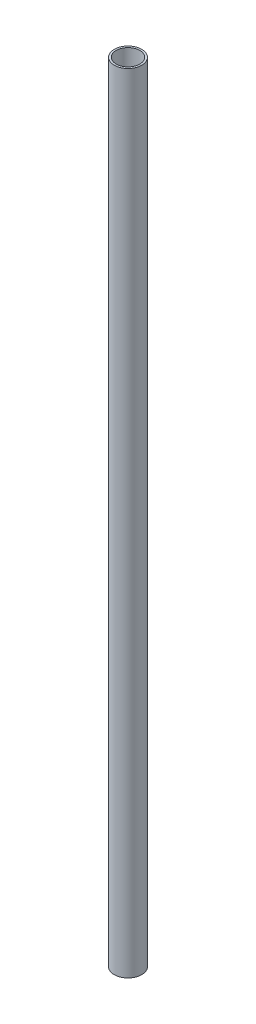
ISO-10303-21;
HEADER;
FILE_DESCRIPTION(('STEP AP214'),'2;1');
FILE_NAME('part.step','',(''),(''),'','','');
FILE_SCHEMA(('AUTOMOTIVE_DESIGN { 1 0 10303 214 1 1 1 1 }'));
ENDSEC;
DATA;
#1=APPLICATION_CONTEXT('core data for automotive mechanical design processes');
#2=APPLICATION_PROTOCOL_DEFINITION('international standard','automotive_design',2000,#1);
#3=PRODUCT_CONTEXT('',#1,'mechanical');
#4=PRODUCT('Part','Part','',(#3));
#5=PRODUCT_RELATED_PRODUCT_CATEGORY('part','',(#4));
#6=PRODUCT_DEFINITION_FORMATION('','',#4);
#7=PRODUCT_DEFINITION_CONTEXT('part definition',#1,'design');
#8=PRODUCT_DEFINITION('design','',#6,#7);
#9=PRODUCT_DEFINITION_SHAPE('','',#8);
#10=(LENGTH_UNIT() NAMED_UNIT(*) SI_UNIT(.MILLI.,.METRE.));
#11=(NAMED_UNIT(*) PLANE_ANGLE_UNIT() SI_UNIT($,.RADIAN.));
#12=(NAMED_UNIT(*) SI_UNIT($,.STERADIAN.) SOLID_ANGLE_UNIT());
#13=UNCERTAINTY_MEASURE_WITH_UNIT(LENGTH_MEASURE(1.E-05),#10,'distance_accuracy_value','');
#14=(GEOMETRIC_REPRESENTATION_CONTEXT(3) GLOBAL_UNCERTAINTY_ASSIGNED_CONTEXT((#13)) GLOBAL_UNIT_ASSIGNED_CONTEXT((#10,
#11,#12)) REPRESENTATION_CONTEXT('',''));
#15=CARTESIAN_POINT('',(0.,0.,0.));
#16=DIRECTION('',(0.,0.,1.));
#17=DIRECTION('',(1.,0.,0.));
#18=AXIS2_PLACEMENT_3D('',#15,#16,#17);
#19=CARTESIAN_POINT('',(0.,658.,0.));
#20=DIRECTION('',(0.,1.,0.));
#21=DIRECTION('',(0.,0.,1.));
#22=AXIS2_PLACEMENT_3D('',#19,#20,#21);
#23=PLANE('',#22);
#24=CARTESIAN_POINT('',(0.,658.,0.));
#25=DIRECTION('',(0.,1.,0.));
#26=DIRECTION('',(0.,0.,1.));
#27=AXIS2_PLACEMENT_3D('',#24,#25,#26);
#28=CIRCLE('',#27,11.5);
#29=CARTESIAN_POINT('',(0.,658.,11.5));
#30=VERTEX_POINT('',#29);
#31=EDGE_CURVE('E10',#30,#30,#28,.T.);
#32=ORIENTED_EDGE('',*,*,#31,.T.);
#33=EDGE_LOOP('',(#32));
#34=FACE_BOUND('',#33,.T.);
#35=CARTESIAN_POINT('',(0.,658.,0.));
#36=DIRECTION('',(0.,1.,0.));
#37=DIRECTION('',(0.,0.,1.));
#38=AXIS2_PLACEMENT_3D('',#35,#36,#37);
#39=CIRCLE('',#38,9.9);
#40=CARTESIAN_POINT('',(0.,658.,9.9));
#41=VERTEX_POINT('',#40);
#42=EDGE_CURVE('E42',#41,#41,#39,.T.);
#43=ORIENTED_EDGE('',*,*,#42,.F.);
#44=EDGE_LOOP('',(#43));
#45=FACE_BOUND('',#44,.T.);
#46=ADVANCED_FACE('F31',(#34,#45),#23,.T.);
#47=CARTESIAN_POINT('',(0.,0.,0.));
#48=DIRECTION('',(0.,1.,0.));
#49=DIRECTION('',(0.,0.,1.));
#50=AXIS2_PLACEMENT_3D('',#47,#48,#49);
#51=PLANE('',#50);
#52=CARTESIAN_POINT('',(0.,0.,0.));
#53=DIRECTION('',(0.,1.,0.));
#54=DIRECTION('',(0.,0.,1.));
#55=AXIS2_PLACEMENT_3D('',#52,#53,#54);
#56=CIRCLE('',#55,11.5);
#57=CARTESIAN_POINT('',(0.,0.,11.5));
#58=VERTEX_POINT('',#57);
#59=EDGE_CURVE('E35',#58,#58,#56,.T.);
#60=ORIENTED_EDGE('',*,*,#59,.F.);
#61=EDGE_LOOP('',(#60));
#62=FACE_BOUND('',#61,.T.);
#63=CARTESIAN_POINT('',(0.,0.,0.));
#64=DIRECTION('',(0.,1.,0.));
#65=DIRECTION('',(0.,0.,1.));
#66=AXIS2_PLACEMENT_3D('',#63,#64,#65);
#67=CIRCLE('',#66,9.9);
#68=CARTESIAN_POINT('',(0.,0.,9.9));
#69=VERTEX_POINT('',#68);
#70=EDGE_CURVE('E44',#69,#69,#67,.T.);
#71=ORIENTED_EDGE('',*,*,#70,.T.);
#72=EDGE_LOOP('',(#71));
#73=FACE_BOUND('',#72,.T.);
#74=ADVANCED_FACE('F54',(#62,#73),#51,.F.);
#75=CARTESIAN_POINT('',(0.,658.,0.));
#76=DIRECTION('',(0.,-1.,0.));
#77=DIRECTION('',(0.,0.,-1.));
#78=AXIS2_PLACEMENT_3D('',#75,#76,#77);
#79=CYLINDRICAL_SURFACE('',#78,11.5);
#80=ORIENTED_EDGE('',*,*,#31,.F.);
#81=EDGE_LOOP('',(#80));
#82=FACE_BOUND('',#81,.T.);
#83=ORIENTED_EDGE('',*,*,#59,.T.);
#84=EDGE_LOOP('',(#83));
#85=FACE_BOUND('',#84,.T.);
#86=ADVANCED_FACE('F33',(#82,#85),#79,.T.);
#87=CARTESIAN_POINT('',(0.,658.,0.));
#88=DIRECTION('',(0.,-1.,0.));
#89=DIRECTION('',(0.,0.,-1.));
#90=AXIS2_PLACEMENT_3D('',#87,#88,#89);
#91=CYLINDRICAL_SURFACE('',#90,9.9);
#92=ORIENTED_EDGE('',*,*,#42,.T.);
#93=EDGE_LOOP('',(#92));
#94=FACE_BOUND('',#93,.T.);
#95=ORIENTED_EDGE('',*,*,#70,.F.);
#96=EDGE_LOOP('',(#95));
#97=FACE_BOUND('',#96,.T.);
#98=ADVANCED_FACE('F50',(#94,#97),#91,.F.);
#99=CLOSED_SHELL('',(#46,#74,#86,#98));
#100=MANIFOLD_SOLID_BREP('B2',#99);
#101=ADVANCED_BREP_SHAPE_REPRESENTATION('',(#18,#100),#14);
#102=SHAPE_DEFINITION_REPRESENTATION(#9,#101);
ENDSEC;
END-ISO-10303-21;
